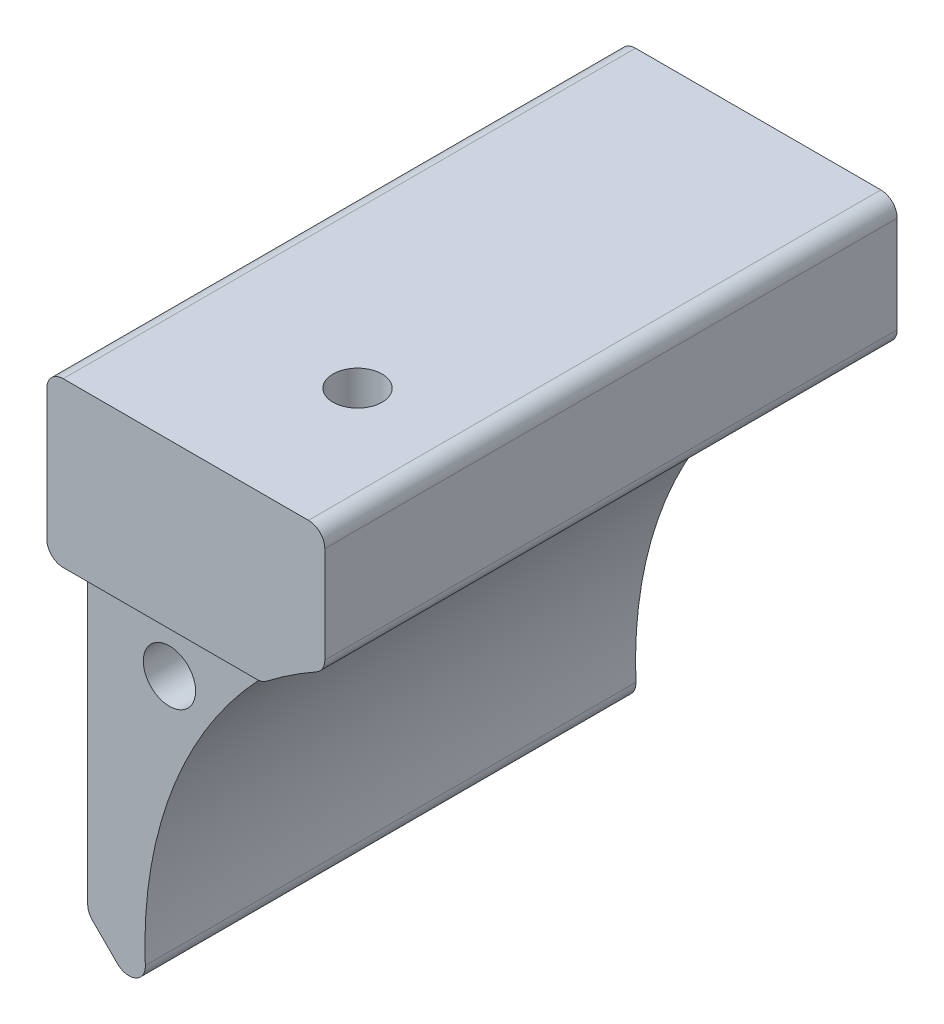
ISO-10303-21;
HEADER;
FILE_DESCRIPTION(('STEP AP214'),'2;1');
FILE_NAME('part.step','',(''),(''),'','','');
FILE_SCHEMA(('AUTOMOTIVE_DESIGN { 1 0 10303 214 1 1 1 1 }'));
ENDSEC;
DATA;
#1=APPLICATION_CONTEXT('core data for automotive mechanical design processes');
#2=APPLICATION_PROTOCOL_DEFINITION('international standard','automotive_design',2000,#1);
#3=PRODUCT_CONTEXT('',#1,'mechanical');
#4=PRODUCT('Part','Part','',(#3));
#5=PRODUCT_RELATED_PRODUCT_CATEGORY('part','',(#4));
#6=PRODUCT_DEFINITION_FORMATION('','',#4);
#7=PRODUCT_DEFINITION_CONTEXT('part definition',#1,'design');
#8=PRODUCT_DEFINITION('design','',#6,#7);
#9=PRODUCT_DEFINITION_SHAPE('','',#8);
#10=(LENGTH_UNIT() NAMED_UNIT(*) SI_UNIT(.MILLI.,.METRE.));
#11=(NAMED_UNIT(*) PLANE_ANGLE_UNIT() SI_UNIT($,.RADIAN.));
#12=(NAMED_UNIT(*) SI_UNIT($,.STERADIAN.) SOLID_ANGLE_UNIT());
#13=UNCERTAINTY_MEASURE_WITH_UNIT(LENGTH_MEASURE(1.E-05),#10,'distance_accuracy_value','');
#14=(GEOMETRIC_REPRESENTATION_CONTEXT(3) GLOBAL_UNCERTAINTY_ASSIGNED_CONTEXT((#13)) GLOBAL_UNIT_ASSIGNED_CONTEXT((#10,
#11,#12)) REPRESENTATION_CONTEXT('',''));
#15=CARTESIAN_POINT('',(0.,0.,0.));
#16=DIRECTION('',(0.,0.,1.));
#17=DIRECTION('',(1.,0.,0.));
#18=AXIS2_PLACEMENT_3D('',#15,#16,#17);
#19=CARTESIAN_POINT('',(36.83,25.4,19.05));
#20=DIRECTION('',(0.,0.,-1.));
#21=DIRECTION('',(-1.,0.,0.));
#22=AXIS2_PLACEMENT_3D('',#19,#20,#21);
#23=CYLINDRICAL_SURFACE('',#22,32.385);
#24=CARTESIAN_POINT('',(13.335,47.688409543976,13.335));
#25=CARTESIAN_POINT('',(13.1784766119884,47.5234064679626,13.3350076883867));
#26=CARTESIAN_POINT('',(13.0234629379012,47.3564801479212,13.3157882640373));
#27=CARTESIAN_POINT('',(12.796815553215,47.1073049650813,13.2590610502784));
#28=CARTESIAN_POINT('',(12.7221324315789,47.0243193556967,13.2354430569835));
#29=CARTESIAN_POINT('',(12.5752408176107,46.8594273918699,13.1787088544088));
#30=CARTESIAN_POINT('',(12.5030311164311,46.7775205226141,13.1455973612799));
#31=CARTESIAN_POINT('',(12.3334229947698,46.5832136683309,13.0543508972633));
#32=CARTESIAN_POINT('',(12.2374866292967,46.4717043220683,12.9915036611409));
#33=CARTESIAN_POINT('',(12.0541142977342,46.2557815744995,12.8449569731667));
#34=CARTESIAN_POINT('',(11.9666572433177,46.1513507741822,12.7613111986368));
#35=CARTESIAN_POINT('',(11.8315395771107,45.9881614423079,12.6028165787355));
#36=CARTESIAN_POINT('',(11.7804187615662,45.9258956960554,12.534549287547));
#37=CARTESIAN_POINT('',(11.6854333639466,45.8094242521853,12.386891093031));
#38=CARTESIAN_POINT('',(11.6415587354645,45.7552074059803,12.3075158772811));
#39=CARTESIAN_POINT('',(11.5732089867869,45.6702975411297,12.1580960504136));
#40=CARTESIAN_POINT('',(11.5466104838771,45.6370896019372,12.0904702906888));
#41=CARTESIAN_POINT('',(11.5006232448518,45.5795009319154,11.9492180449502));
#42=CARTESIAN_POINT('',(11.4812283301229,45.5551126368353,11.8755967677719));
#43=CARTESIAN_POINT('',(11.4510477848778,45.5170977553062,11.7229968413844));
#44=CARTESIAN_POINT('',(11.4403532169504,45.5035850136167,11.6439706814186));
#45=CARTESIAN_POINT('',(11.4290875422931,45.4893495891948,11.48407687588));
#46=CARTESIAN_POINT('',(11.4285067822604,45.4886147104063,11.4032110600435));
#47=CARTESIAN_POINT('',(11.436806299516,45.4991034208255,11.2552933354621));
#48=CARTESIAN_POINT('',(11.4442546928455,45.5085171706012,11.1880184655045));
#49=CARTESIAN_POINT('',(11.4658195935947,45.5357114848126,11.0563041571546));
#50=CARTESIAN_POINT('',(11.4799393848802,45.5534961696614,10.9918661322387));
#51=CARTESIAN_POINT('',(11.5192548314741,45.6028629702805,10.847499821178));
#52=CARTESIAN_POINT('',(11.5465330308157,45.637020262551,10.7690260549805));
#53=CARTESIAN_POINT('',(11.6088142097584,45.7145882097106,10.6201523733937));
#54=CARTESIAN_POINT('',(11.6438323637398,45.7580170358955,10.5497687367494));
#55=CARTESIAN_POINT('',(11.7374131030694,45.8733494371386,10.3863124041951));
#56=CARTESIAN_POINT('',(11.7993505160223,45.9491013487308,10.2979152597211));
#57=CARTESIAN_POINT('',(11.9319119802338,46.1095228593856,10.1372296934186));
#58=CARTESIAN_POINT('',(12.0025548052287,46.1942116728796,10.0649770659012));
#59=CARTESIAN_POINT('',(12.1314238082989,46.3469781000642,9.95155290873929));
#60=CARTESIAN_POINT('',(12.1882815550314,46.4138509232193,9.90713989177675));
#61=CARTESIAN_POINT('',(12.304839619222,46.549769966759,9.82599289338699));
#62=CARTESIAN_POINT('',(12.3645412772173,46.6188172067981,9.7892625782295));
#63=CARTESIAN_POINT('',(12.5471727701733,46.8281750278204,9.69000319706788));
#64=CARTESIAN_POINT('',(12.6736293376177,46.9707019637243,9.63840551421837));
#65=CARTESIAN_POINT('',(12.936771405676,47.2618774659836,9.56189949267807));
#66=CARTESIAN_POINT('',(13.0736541453998,47.4105767889815,9.53788982776896));
#67=CARTESIAN_POINT('',(13.3511420678159,47.7063322111869,9.52000876276544));
#68=CARTESIAN_POINT('',(13.4917453162943,47.8533891098254,9.52612199711666));
#69=CARTESIAN_POINT('',(13.7555229377572,48.1241700579003,9.56782161020136));
#70=CARTESIAN_POINT('',(13.8786673515774,48.2485041080893,9.59960806192232));
#71=CARTESIAN_POINT('',(14.1218793169272,48.4902292432726,9.69027350284481));
#72=CARTESIAN_POINT('',(14.241950732527,48.6076293176428,9.74911650480501));
#73=CARTESIAN_POINT('',(14.4421877940122,48.8005958028193,9.87657345314288));
#74=CARTESIAN_POINT('',(14.5242864439906,48.8788222679808,9.93811408916236));
#75=CARTESIAN_POINT('',(14.6812930446369,49.0269883840897,10.0781319241031));
#76=CARTESIAN_POINT('',(14.7562107024831,49.0969392527513,10.1565857798434));
#77=CARTESIAN_POINT('',(14.8797684863723,49.2113641628716,10.3118337516578));
#78=CARTESIAN_POINT('',(14.930574639518,49.2580661645682,10.3852506413046));
#79=CARTESIAN_POINT('',(15.0229957974978,49.3425710160744,10.5423246520955));
#80=CARTESIAN_POINT('',(15.0646212342899,49.3803839696746,10.6259699809382));
#81=CARTESIAN_POINT('',(15.1305987106132,49.4400892021544,10.7886461855446));
#82=CARTESIAN_POINT('',(15.1566187436528,49.4635317719265,10.8664269890782));
#83=CARTESIAN_POINT('',(15.1986757375582,49.5013452646282,11.0267717903517));
#84=CARTESIAN_POINT('',(15.214717679628,49.5157207140428,11.1093333789177));
#85=CARTESIAN_POINT('',(15.2357605917544,49.5345656275648,11.2772913901259));
#86=CARTESIAN_POINT('',(15.2407217415004,49.5389993650228,11.3626969210315));
#87=CARTESIAN_POINT('',(15.2391081125055,49.5375560875781,11.533309796876));
#88=CARTESIAN_POINT('',(15.232533909212,49.5316795870073,11.6185171514888));
#89=CARTESIAN_POINT('',(15.2090768700584,49.5106642162333,11.7809978733717));
#90=CARTESIAN_POINT('',(15.1928332854846,49.4960996085375,11.858441133176));
#91=CARTESIAN_POINT('',(15.1515805145574,49.4589924603249,12.0089233627841));
#92=CARTESIAN_POINT('',(15.1265700134227,49.4364487231669,12.0819616700471));
#93=CARTESIAN_POINT('',(15.067027652593,49.382555578019,12.227310041733));
#94=CARTESIAN_POINT('',(15.0319478126445,49.3506964486838,12.2992038429575));
#95=CARTESIAN_POINT('',(14.9548636839167,49.2803134293719,12.4355925486005));
#96=CARTESIAN_POINT('',(14.9128555835544,49.2417858701778,12.5000833469474));
#97=CARTESIAN_POINT('',(14.8009590830295,49.1385313112804,12.6517975991957));
#98=CARTESIAN_POINT('',(14.7276612553344,49.0703615303977,12.7341801028094));
#99=CARTESIAN_POINT('',(14.573045690148,48.9250410008117,12.8818099544788));
#100=CARTESIAN_POINT('',(14.4917077508195,48.8478675368178,12.9470125492092));
#101=CARTESIAN_POINT('',(14.2939622754741,48.6581181370542,13.0818009042286));
#102=CARTESIAN_POINT('',(14.1754868780411,48.5428125522876,13.1444857669573));
#103=CARTESIAN_POINT('',(13.9350523546374,48.3049835270208,13.242686855933));
#104=CARTESIAN_POINT('',(13.8130944570975,48.1824626158702,13.2782125425495));
#105=CARTESIAN_POINT('',(13.6315969027971,47.9971147091696,13.3127414709949));
#106=CARTESIAN_POINT('',(13.5720781261598,47.9358514873036,13.3211313778886));
#107=CARTESIAN_POINT('',(13.4533013423157,47.812619764453,13.3322583245684));
#108=CARTESIAN_POINT('',(13.3940432606298,47.7506514858707,13.3349970998109));
#109=CARTESIAN_POINT('',(13.335,47.688409543976,13.335));
#110=B_SPLINE_CURVE_WITH_KNOTS('',3,(#24,#25,#26,#27,#28,#29,#30,#31,#32,#33,#34,#35,#36,#37,
#38,#39,#40,#41,#42,#43,#44,#45,#46,#47,#48,#49,#50,#51,#52,#53,#54,#55,#56,#57,#58,#59,#60,#61,
#62,#63,#64,#65,#66,#67,#68,#69,#70,#71,#72,#73,#74,#75,#76,#77,#78,#79,#80,#81,#82,#83,#84,#85,
#86,#87,#88,#89,#90,#91,#92,#93,#94,#95,#96,#97,#98,#99,#100,#101,#102,#103,#104,#105,#106,#107,
#108,#109),.UNSPECIFIED.,.T.,.F.,(4,2,2,2,2,2,2,2,2,2,2,2,2,2,2,2,2,2,2,2,2,2,2,2,2,2,2,2,2,2,2,
2,2,2,2,2,2,2,2,2,2,2,4),(0.,0.681914945815989,1.02395035740759,1.36581614725854,
1.84426007558729,2.32148181372793,2.6374137151777,2.95290385040537,3.19173893203823,
3.43036868597695,3.67146504979722,3.91233128230528,4.11639842274227,4.32056611606572,
4.58855639743633,4.85707681602845,5.25050481256712,5.64479661644895,5.93953460419483,
6.23441292485613,6.82416844538339,7.43263440321242,8.04079001745469,8.5725286988837,
9.10356216476116,9.48936597518929,9.87464067990913,10.1758000146303,10.4766153614651,
10.7314342149974,10.9861257570426,11.2417311045603,11.4973237014264,11.737648322782,
11.978009001237,12.2353565515164,12.4928461567557,12.8796004722839,13.2673525314228,
13.7949554403331,14.3223744852162,14.5796833295377,14.8369131428241),.UNSPECIFIED.);
#111=CARTESIAN_POINT('',(13.335,47.688409543976,13.335));
#112=VERTEX_POINT('',#111);
#113=EDGE_CURVE('E202',#112,#112,#110,.T.);
#114=ORIENTED_EDGE('',*,*,#113,.F.);
#115=EDGE_LOOP('',(#114));
#116=FACE_BOUND('',#115,.T.);
#117=CARTESIAN_POINT('',(36.83,25.4,-19.05));
#118=DIRECTION('',(0.,0.,1.));
#119=DIRECTION('',(1.,0.,0.));
#120=AXIS2_PLACEMENT_3D('',#117,#118,#119);
#121=CIRCLE('',#120,32.385);
#122=CARTESIAN_POINT('',(17.0773132260454,51.0635849056604,-19.05));
#123=VERTEX_POINT('',#122);
#124=CARTESIAN_POINT('',(4.47337115952391,24.0447158675499,-19.05));
#125=VERTEX_POINT('',#124);
#126=EDGE_CURVE('E351',#123,#125,#121,.T.);
#127=ORIENTED_EDGE('',*,*,#126,.F.);
#128=DIRECTION('',(0.,0.,-1.));
#129=VECTOR('',#128,1.);
#130=CARTESIAN_POINT('',(17.0773132260454,51.0635849056604,19.05));
#131=LINE('',#130,#129);
#132=CARTESIAN_POINT('',(17.0773132260454,51.0635849056604,-22.225));
#133=VERTEX_POINT('',#132);
#134=EDGE_CURVE('E227',#123,#133,#131,.T.);
#135=ORIENTED_EDGE('',*,*,#134,.T.);
#136=CARTESIAN_POINT('',(36.83,25.4,-22.225));
#137=DIRECTION('',(0.,0.,-1.));
#138=DIRECTION('',(-1.,0.,0.));
#139=AXIS2_PLACEMENT_3D('',#136,#137,#138);
#140=CIRCLE('',#139,32.385);
#141=CARTESIAN_POINT('',(20.9430188679245,53.6204191235544,-22.225));
#142=VERTEX_POINT('',#141);
#143=EDGE_CURVE('E365',#133,#142,#140,.T.);
#144=ORIENTED_EDGE('',*,*,#143,.T.);
#145=DIRECTION('',(0.,0.,-1.));
#146=VECTOR('',#145,1.);
#147=CARTESIAN_POINT('',(20.9430188679245,53.6204191235544,19.05));
#148=LINE('',#147,#146);
#149=CARTESIAN_POINT('',(20.9430188679245,53.6204191235544,22.225));
#150=VERTEX_POINT('',#149);
#151=EDGE_CURVE('E224',#142,#150,#148,.F.);
#152=ORIENTED_EDGE('',*,*,#151,.T.);
#153=CARTESIAN_POINT('',(36.83,25.4,22.225));
#154=DIRECTION('',(0.,0.,-1.));
#155=DIRECTION('',(-1.,0.,0.));
#156=AXIS2_PLACEMENT_3D('',#153,#154,#155);
#157=CIRCLE('',#156,32.385);
#158=CARTESIAN_POINT('',(17.0773132260454,51.0635849056604,22.225));
#159=VERTEX_POINT('',#158);
#160=EDGE_CURVE('E325',#159,#150,#157,.T.);
#161=ORIENTED_EDGE('',*,*,#160,.F.);
#162=DIRECTION('',(0.,0.,-1.));
#163=VECTOR('',#162,1.);
#164=CARTESIAN_POINT('',(17.0773132260454,51.0635849056604,19.05));
#165=LINE('',#164,#163);
#166=CARTESIAN_POINT('',(17.0773132260454,51.0635849056604,19.05));
#167=VERTEX_POINT('',#166);
#168=EDGE_CURVE('E220',#159,#167,#165,.T.);
#169=ORIENTED_EDGE('',*,*,#168,.T.);
#170=CARTESIAN_POINT('',(36.83,25.4,19.05));
#171=DIRECTION('',(0.,0.,1.));
#172=DIRECTION('',(1.,0.,0.));
#173=AXIS2_PLACEMENT_3D('',#170,#171,#172);
#174=CIRCLE('',#173,32.385);
#175=CARTESIAN_POINT('',(4.47337115952391,24.0447158675499,19.05));
#176=VERTEX_POINT('',#175);
#177=EDGE_CURVE('E305',#167,#176,#174,.T.);
#178=ORIENTED_EDGE('',*,*,#177,.T.);
#179=DIRECTION('',(0.,0.,-1.));
#180=VECTOR('',#179,1.);
#181=CARTESIAN_POINT('',(4.47337115952391,24.0447158675499,19.05));
#182=LINE('',#181,#180);
#183=EDGE_CURVE('E210',#176,#125,#182,.T.);
#184=ORIENTED_EDGE('',*,*,#183,.T.);
#185=EDGE_LOOP('',(#127,#135,#144,#152,#161,#169,#178,#184));
#186=FACE_BOUND('',#185,.T.);
#187=ADVANCED_FACE('F41',(#116,#186),#23,.F.);
#188=CARTESIAN_POINT('',(21.59,0.,19.05));
#189=DIRECTION('',(-1.,0.,0.));
#190=DIRECTION('',(0.,-1.,0.));
#191=AXIS2_PLACEMENT_3D('',#188,#189,#190);
#192=PLANE('',#191);
#193=DIRECTION('',(0.,1.,0.));
#194=VECTOR('',#193,1.);
#195=CARTESIAN_POINT('',(21.59,63.5,-22.225));
#196=LINE('',#195,#194);
#197=CARTESIAN_POINT('',(21.59,54.7271022264389,-22.225));
#198=VERTEX_POINT('',#197);
#199=CARTESIAN_POINT('',(21.59,62.23,-22.225));
#200=VERTEX_POINT('',#199);
#201=EDGE_CURVE('E370',#198,#200,#196,.T.);
#202=ORIENTED_EDGE('',*,*,#201,.T.);
#203=DIRECTION('',(0.,0.,-1.));
#204=VECTOR('',#203,1.);
#205=CARTESIAN_POINT('',(21.59,62.23,22.225));
#206=LINE('',#205,#204);
#207=CARTESIAN_POINT('',(21.59,62.23,22.225));
#208=VERTEX_POINT('',#207);
#209=EDGE_CURVE('E251',#200,#208,#206,.F.);
#210=ORIENTED_EDGE('',*,*,#209,.T.);
#211=DIRECTION('',(0.,1.,0.));
#212=VECTOR('',#211,1.);
#213=CARTESIAN_POINT('',(21.59,63.5,22.225));
#214=LINE('',#213,#212);
#215=CARTESIAN_POINT('',(21.59,54.7271022264389,22.225));
#216=VERTEX_POINT('',#215);
#217=EDGE_CURVE('E332',#216,#208,#214,.T.);
#218=ORIENTED_EDGE('',*,*,#217,.F.);
#219=DIRECTION('',(0.,0.,1.));
#220=VECTOR('',#219,1.);
#221=CARTESIAN_POINT('',(21.59,54.7271022264389,-22.225));
#222=LINE('',#221,#220);
#223=EDGE_CURVE('E247',#216,#198,#222,.F.);
#224=ORIENTED_EDGE('',*,*,#223,.T.);
#225=EDGE_LOOP('',(#202,#210,#218,#224));
#226=FACE_BOUND('',#225,.T.);
#227=ADVANCED_FACE('F433',(#226),#192,.F.);
#228=CARTESIAN_POINT('',(0.,63.5,19.05));
#229=DIRECTION('',(0.,1.,0.));
#230=DIRECTION('',(0.,0.,1.));
#231=AXIS2_PLACEMENT_3D('',#228,#229,#230);
#232=PLANE('',#231);
#233=CARTESIAN_POINT('',(13.335,63.5,11.43));
#234=DIRECTION('',(0.,1.,0.));
#235=DIRECTION('',(0.,0.,1.));
#236=AXIS2_PLACEMENT_3D('',#233,#234,#235);
#237=CIRCLE('',#236,1.905);
#238=CARTESIAN_POINT('',(13.335,63.5,13.335));
#239=VERTEX_POINT('',#238);
#240=EDGE_CURVE('E404',#239,#239,#237,.T.);
#241=ORIENTED_EDGE('',*,*,#240,.F.);
#242=EDGE_LOOP('',(#241));
#243=FACE_BOUND('',#242,.T.);
#244=DIRECTION('',(-1.,0.,0.));
#245=VECTOR('',#244,1.);
#246=CARTESIAN_POINT('',(0.,63.5,22.225));
#247=LINE('',#246,#245);
#248=CARTESIAN_POINT('',(20.32,63.5,22.225));
#249=VERTEX_POINT('',#248);
#250=CARTESIAN_POINT('',(1.27,63.5,22.225));
#251=VERTEX_POINT('',#250);
#252=EDGE_CURVE('E335',#249,#251,#247,.T.);
#253=ORIENTED_EDGE('',*,*,#252,.F.);
#254=DIRECTION('',(0.,0.,-1.));
#255=VECTOR('',#254,1.);
#256=CARTESIAN_POINT('',(20.32,63.5,-22.225));
#257=LINE('',#256,#255);
#258=CARTESIAN_POINT('',(20.32,63.5,-22.225));
#259=VERTEX_POINT('',#258);
#260=EDGE_CURVE('E244',#249,#259,#257,.T.);
#261=ORIENTED_EDGE('',*,*,#260,.T.);
#262=DIRECTION('',(-1.,0.,0.));
#263=VECTOR('',#262,1.);
#264=CARTESIAN_POINT('',(0.,63.5,-22.225));
#265=LINE('',#264,#263);
#266=CARTESIAN_POINT('',(1.27,63.5,-22.225));
#267=VERTEX_POINT('',#266);
#268=EDGE_CURVE('E376',#259,#267,#265,.T.);
#269=ORIENTED_EDGE('',*,*,#268,.T.);
#270=DIRECTION('',(0.,0.,-1.));
#271=VECTOR('',#270,1.);
#272=CARTESIAN_POINT('',(1.27,63.5,19.05));
#273=LINE('',#272,#271);
#274=EDGE_CURVE('E241',#267,#251,#273,.F.);
#275=ORIENTED_EDGE('',*,*,#274,.T.);
#276=EDGE_LOOP('',(#253,#261,#269,#275));
#277=FACE_BOUND('',#276,.T.);
#278=ADVANCED_FACE('F431',(#243,#277),#232,.T.);
#279=CARTESIAN_POINT('',(0.,0.,19.05));
#280=DIRECTION('',(-1.,0.,0.));
#281=DIRECTION('',(0.,0.,1.));
#282=AXIS2_PLACEMENT_3D('',#279,#280,#281);
#283=PLANE('',#282);
#284=DIRECTION('',(0.,-1.,0.));
#285=VECTOR('',#284,1.);
#286=CARTESIAN_POINT('',(0.,63.5,-22.225));
#287=LINE('',#286,#285);
#288=CARTESIAN_POINT('',(0.,62.23,-22.225));
#289=VERTEX_POINT('',#288);
#290=CARTESIAN_POINT('',(0.,52.07,-22.225));
#291=VERTEX_POINT('',#290);
#292=EDGE_CURVE('E201',#289,#291,#287,.T.);
#293=ORIENTED_EDGE('',*,*,#292,.T.);
#294=DIRECTION('',(0.,0.,1.));
#295=VECTOR('',#294,1.);
#296=CARTESIAN_POINT('',(0.,52.07,19.05));
#297=LINE('',#296,#295);
#298=CARTESIAN_POINT('',(0.,52.07,-19.05));
#299=VERTEX_POINT('',#298);
#300=EDGE_CURVE('E280',#291,#299,#297,.T.);
#301=ORIENTED_EDGE('',*,*,#300,.T.);
#302=DIRECTION('',(0.,1.,0.));
#303=VECTOR('',#302,1.);
#304=CARTESIAN_POINT('',(0.,0.,-19.05));
#305=LINE('',#304,#303);
#306=CARTESIAN_POINT('',(0.,25.9260512242139,-19.05));
#307=VERTEX_POINT('',#306);
#308=EDGE_CURVE('E186',#307,#299,#305,.T.);
#309=ORIENTED_EDGE('',*,*,#308,.F.);
#310=DIRECTION('',(0.,0.,-1.));
#311=VECTOR('',#310,1.);
#312=CARTESIAN_POINT('',(0.,25.9260512242139,19.05));
#313=LINE('',#312,#311);
#314=CARTESIAN_POINT('',(0.,25.9260512242139,19.05));
#315=VERTEX_POINT('',#314);
#316=EDGE_CURVE('E272',#307,#315,#313,.F.);
#317=ORIENTED_EDGE('',*,*,#316,.T.);
#318=DIRECTION('',(0.,1.,0.));
#319=VECTOR('',#318,1.);
#320=CARTESIAN_POINT('',(0.,0.,19.05));
#321=LINE('',#320,#319);
#322=CARTESIAN_POINT('',(0.,52.07,19.05));
#323=VERTEX_POINT('',#322);
#324=EDGE_CURVE('E212',#315,#323,#321,.T.);
#325=ORIENTED_EDGE('',*,*,#324,.T.);
#326=DIRECTION('',(0.,0.,-1.));
#327=VECTOR('',#326,1.);
#328=CARTESIAN_POINT('',(0.,52.07,22.225));
#329=LINE('',#328,#327);
#330=CARTESIAN_POINT('',(0.,52.07,22.225));
#331=VERTEX_POINT('',#330);
#332=EDGE_CURVE('E278',#323,#331,#329,.F.);
#333=ORIENTED_EDGE('',*,*,#332,.T.);
#334=DIRECTION('',(0.,-1.,0.));
#335=VECTOR('',#334,1.);
#336=CARTESIAN_POINT('',(0.,63.5,22.225));
#337=LINE('',#336,#335);
#338=CARTESIAN_POINT('',(0.,62.23,22.225));
#339=VERTEX_POINT('',#338);
#340=EDGE_CURVE('E315',#339,#331,#337,.T.);
#341=ORIENTED_EDGE('',*,*,#340,.F.);
#342=DIRECTION('',(0.,0.,-1.));
#343=VECTOR('',#342,1.);
#344=CARTESIAN_POINT('',(0.,62.23,19.05));
#345=LINE('',#344,#343);
#346=EDGE_CURVE('E274',#339,#289,#345,.T.);
#347=ORIENTED_EDGE('',*,*,#346,.T.);
#348=EDGE_LOOP('',(#293,#301,#309,#317,#325,#333,#341,#347));
#349=FACE_BOUND('',#348,.T.);
#350=ADVANCED_FACE('F391',(#349),#283,.T.);
#351=CARTESIAN_POINT('',(6.35,44.45,19.05));
#352=DIRECTION('',(0.,0.,-1.));
#353=DIRECTION('',(-1.,0.,0.));
#354=AXIS2_PLACEMENT_3D('',#351,#352,#353);
#355=CYLINDRICAL_SURFACE('',#354,2.032);
#356=CARTESIAN_POINT('',(6.35,44.45,19.05));
#357=DIRECTION('',(0.,0.,1.));
#358=DIRECTION('',(1.,0.,0.));
#359=AXIS2_PLACEMENT_3D('',#356,#357,#358);
#360=CIRCLE('',#359,2.032);
#361=CARTESIAN_POINT('',(4.318,44.45,19.05));
#362=VERTEX_POINT('',#361);
#363=EDGE_CURVE('E344',#362,#362,#360,.T.);
#364=CARTESIAN_POINT('',(6.35,44.45,-19.05));
#365=DIRECTION('',(0.,0.,1.));
#366=DIRECTION('',(1.,0.,0.));
#367=AXIS2_PLACEMENT_3D('',#364,#365,#366);
#368=CIRCLE('',#367,2.032);
#369=CARTESIAN_POINT('',(4.318,44.45,-19.05));
#370=VERTEX_POINT('',#369);
#371=EDGE_CURVE('E342',#370,#370,#368,.T.);
#372=CARTESIAN_POINT('',(4.318,44.45,19.05));
#373=CARTESIAN_POINT('',(4.318,44.45,18.653125));
#374=CARTESIAN_POINT('',(4.318,44.45,18.25625));
#375=CARTESIAN_POINT('',(4.318,44.45,17.4625));
#376=CARTESIAN_POINT('',(4.318,44.45,17.065625));
#377=CARTESIAN_POINT('',(4.318,44.45,16.271875));
#378=CARTESIAN_POINT('',(4.318,44.45,15.875));
#379=CARTESIAN_POINT('',(4.318,44.45,15.08125));
#380=CARTESIAN_POINT('',(4.318,44.45,14.684375));
#381=CARTESIAN_POINT('',(4.318,44.45,13.890625));
#382=CARTESIAN_POINT('',(4.318,44.45,13.49375));
#383=CARTESIAN_POINT('',(4.318,44.45,12.7));
#384=CARTESIAN_POINT('',(4.318,44.45,12.303125));
#385=CARTESIAN_POINT('',(4.318,44.45,11.509375));
#386=CARTESIAN_POINT('',(4.318,44.45,11.1125));
#387=CARTESIAN_POINT('',(4.318,44.45,10.31875));
#388=CARTESIAN_POINT('',(4.318,44.45,9.921875));
#389=CARTESIAN_POINT('',(4.318,44.45,9.128125));
#390=CARTESIAN_POINT('',(4.318,44.45,8.73125));
#391=CARTESIAN_POINT('',(4.318,44.45,7.9375));
#392=CARTESIAN_POINT('',(4.318,44.45,7.540625));
#393=CARTESIAN_POINT('',(4.318,44.45,6.746875));
#394=CARTESIAN_POINT('',(4.318,44.45,6.35));
#395=CARTESIAN_POINT('',(4.318,44.45,5.55625));
#396=CARTESIAN_POINT('',(4.318,44.45,5.159375));
#397=CARTESIAN_POINT('',(4.318,44.45,4.365625));
#398=CARTESIAN_POINT('',(4.318,44.45,3.96875));
#399=CARTESIAN_POINT('',(4.318,44.45,3.175));
#400=CARTESIAN_POINT('',(4.318,44.45,2.778125));
#401=CARTESIAN_POINT('',(4.318,44.45,1.984375));
#402=CARTESIAN_POINT('',(4.318,44.45,1.5875));
#403=CARTESIAN_POINT('',(4.318,44.45,0.79375));
#404=CARTESIAN_POINT('',(4.318,44.45,0.396875));
#405=CARTESIAN_POINT('',(4.318,44.45,-0.396875));
#406=CARTESIAN_POINT('',(4.318,44.45,-0.79375));
#407=CARTESIAN_POINT('',(4.318,44.45,-1.5875));
#408=CARTESIAN_POINT('',(4.318,44.45,-1.984375));
#409=CARTESIAN_POINT('',(4.318,44.45,-2.778125));
#410=CARTESIAN_POINT('',(4.318,44.45,-3.175));
#411=CARTESIAN_POINT('',(4.318,44.45,-3.96875));
#412=CARTESIAN_POINT('',(4.318,44.45,-4.365625));
#413=CARTESIAN_POINT('',(4.318,44.45,-5.159375));
#414=CARTESIAN_POINT('',(4.318,44.45,-5.55625));
#415=CARTESIAN_POINT('',(4.318,44.45,-6.35));
#416=CARTESIAN_POINT('',(4.318,44.45,-6.746875));
#417=CARTESIAN_POINT('',(4.318,44.45,-7.540625));
#418=CARTESIAN_POINT('',(4.318,44.45,-7.9375));
#419=CARTESIAN_POINT('',(4.318,44.45,-8.73125));
#420=CARTESIAN_POINT('',(4.318,44.45,-9.128125));
#421=CARTESIAN_POINT('',(4.318,44.45,-9.921875));
#422=CARTESIAN_POINT('',(4.318,44.45,-10.31875));
#423=CARTESIAN_POINT('',(4.318,44.45,-11.1125));
#424=CARTESIAN_POINT('',(4.318,44.45,-11.509375));
#425=CARTESIAN_POINT('',(4.318,44.45,-12.303125));
#426=CARTESIAN_POINT('',(4.318,44.45,-12.7));
#427=CARTESIAN_POINT('',(4.318,44.45,-13.49375));
#428=CARTESIAN_POINT('',(4.318,44.45,-13.890625));
#429=CARTESIAN_POINT('',(4.318,44.45,-14.684375));
#430=CARTESIAN_POINT('',(4.318,44.45,-15.08125));
#431=CARTESIAN_POINT('',(4.318,44.45,-15.875));
#432=CARTESIAN_POINT('',(4.318,44.45,-16.271875));
#433=CARTESIAN_POINT('',(4.318,44.45,-17.065625));
#434=CARTESIAN_POINT('',(4.318,44.45,-17.4625));
#435=CARTESIAN_POINT('',(4.318,44.45,-18.25625));
#436=CARTESIAN_POINT('',(4.318,44.45,-18.653125));
#437=CARTESIAN_POINT('',(4.318,44.45,-19.05));
#438=B_SPLINE_CURVE_WITH_KNOTS('',3,(#372,#373,#374,#375,#376,#377,#378,#379,#380,#381,#382,
#383,#384,#385,#386,#387,#388,#389,#390,#391,#392,#393,#394,#395,#396,#397,#398,#399,#400,#401,
#402,#403,#404,#405,#406,#407,#408,#409,#410,#411,#412,#413,#414,#415,#416,#417,#418,#419,#420,
#421,#422,#423,#424,#425,#426,#427,#428,#429,#430,#431,#432,#433,#434,#435,#436,#437),
.UNSPECIFIED.,.F.,.F.,(4,2,2,2,2,2,2,2,2,2,2,2,2,2,2,2,2,2,2,2,2,2,2,2,2,2,2,2,2,2,2,2,4),(0.,
1.190625,2.38125,3.571875,4.7625,5.953125,7.14375,8.334375,9.525,10.715625,11.90625,13.096875,
14.2875,15.478125,16.66875,17.859375,19.05,20.240625,21.43125,22.621875,23.8125,25.003125,
26.19375,27.384375,28.575,29.765625,30.95625,32.146875,33.3375,34.528125,35.71875,36.909375,
38.1),.UNSPECIFIED.);
#439=EDGE_CURVE('BSEAM428',#362,#370,#438,.T.);
#440=ORIENTED_EDGE('',*,*,#363,.T.);
#441=ORIENTED_EDGE('',*,*,#371,.F.);
#442=ORIENTED_EDGE('',*,*,#439,.T.);
#443=ORIENTED_EDGE('',*,*,#439,.F.);
#444=EDGE_LOOP('',(#440,#442,#441,#443));
#445=FACE_BOUND('',#444,.T.);
#446=ADVANCED_FACE('F428',(#445),#355,.F.);
#447=CARTESIAN_POINT('',(12.7,12.7000000000001,19.05));
#448=DIRECTION('',(0.707106781186547,0.707106781186548,0.));
#449=DIRECTION('',(-0.707106781186548,0.707106781186547,0.));
#450=AXIS2_PLACEMENT_3D('',#447,#448,#449);
#451=PLANE('',#450);
#452=DIRECTION('',(0.707106781186548,-0.707106781186547,0.));
#453=VECTOR('',#452,1.);
#454=CARTESIAN_POINT('',(12.7,12.7000000000001,-19.05));
#455=LINE('',#454,#453);
#456=CARTESIAN_POINT('',(0.371974387893088,25.028025612107,-19.05));
#457=VERTEX_POINT('',#456);
#458=CARTESIAN_POINT('',(2.30645814190813,23.093541858092,-19.05));
#459=VERTEX_POINT('',#458);
#460=EDGE_CURVE('E215',#457,#459,#455,.T.);
#461=ORIENTED_EDGE('',*,*,#460,.T.);
#462=DIRECTION('',(0.,0.,1.));
#463=VECTOR('',#462,1.);
#464=CARTESIAN_POINT('',(2.30645814190813,23.093541858092,19.05));
#465=LINE('',#464,#463);
#466=CARTESIAN_POINT('',(2.30645814190813,23.093541858092,19.05));
#467=VERTEX_POINT('',#466);
#468=EDGE_CURVE('E56',#459,#467,#465,.T.);
#469=ORIENTED_EDGE('',*,*,#468,.T.);
#470=DIRECTION('',(0.707106781186548,-0.707106781186547,0.));
#471=VECTOR('',#470,1.);
#472=CARTESIAN_POINT('',(12.7,12.7000000000001,19.05));
#473=LINE('',#472,#471);
#474=CARTESIAN_POINT('',(0.371974387893088,25.028025612107,19.05));
#475=VERTEX_POINT('',#474);
#476=EDGE_CURVE('E207',#475,#467,#473,.T.);
#477=ORIENTED_EDGE('',*,*,#476,.F.);
#478=DIRECTION('',(0.,0.,-1.));
#479=VECTOR('',#478,1.);
#480=CARTESIAN_POINT('',(0.371974387893086,25.028025612107,-19.05));
#481=LINE('',#480,#479);
#482=EDGE_CURVE('E286',#475,#457,#481,.T.);
#483=ORIENTED_EDGE('',*,*,#482,.T.);
#484=EDGE_LOOP('',(#461,#469,#477,#483));
#485=FACE_BOUND('',#484,.T.);
#486=ADVANCED_FACE('F354',(#485),#451,.F.);
#487=CARTESIAN_POINT('',(0.,0.,19.05));
#488=DIRECTION('',(0.,0.,1.));
#489=DIRECTION('',(1.,0.,0.));
#490=AXIS2_PLACEMENT_3D('',#487,#488,#489);
#491=PLANE('',#490);
#492=ORIENTED_EDGE('',*,*,#476,.T.);
#493=CARTESIAN_POINT('',(3.20448375401505,23.9915674701989,19.05));
#494=DIRECTION('',(0.,0.,1.));
#495=DIRECTION('',(1.,0.,0.));
#496=AXIS2_PLACEMENT_3D('',#493,#494,#495);
#497=CIRCLE('',#496,1.27);
#498=EDGE_CURVE('E291',#467,#176,#497,.T.);
#499=ORIENTED_EDGE('',*,*,#498,.T.);
#500=ORIENTED_EDGE('',*,*,#177,.F.);
#501=CARTESIAN_POINT('',(16.3026980584393,52.07,19.05));
#502=DIRECTION('',(0.,0.,1.));
#503=DIRECTION('',(1.,0.,0.));
#504=AXIS2_PLACEMENT_3D('',#501,#502,#503);
#505=CIRCLE('',#504,1.27);
#506=CARTESIAN_POINT('',(16.3026980584393,50.8,19.05));
#507=VERTEX_POINT('',#506);
#508=EDGE_CURVE('E191',#167,#507,#505,.F.);
#509=ORIENTED_EDGE('',*,*,#508,.T.);
#510=DIRECTION('',(1.,0.,0.));
#511=VECTOR('',#510,1.);
#512=CARTESIAN_POINT('',(0.,50.8,19.05));
#513=LINE('',#512,#511);
#514=CARTESIAN_POINT('',(1.27,50.8,19.05));
#515=VERTEX_POINT('',#514);
#516=EDGE_CURVE('E303',#515,#507,#513,.T.);
#517=ORIENTED_EDGE('',*,*,#516,.F.);
#518=CARTESIAN_POINT('',(1.27,52.07,19.05));
#519=DIRECTION('',(0.,0.,1.));
#520=DIRECTION('',(1.,0.,0.));
#521=AXIS2_PLACEMENT_3D('',#518,#519,#520);
#522=CIRCLE('',#521,1.27);
#523=EDGE_CURVE('E11',#515,#323,#522,.F.);
#524=ORIENTED_EDGE('',*,*,#523,.T.);
#525=ORIENTED_EDGE('',*,*,#324,.F.);
#526=CARTESIAN_POINT('',(1.27,25.9260512242139,19.05));
#527=DIRECTION('',(0.,0.,1.));
#528=DIRECTION('',(1.,0.,0.));
#529=AXIS2_PLACEMENT_3D('',#526,#527,#528);
#530=CIRCLE('',#529,1.27);
#531=EDGE_CURVE('E63',#315,#475,#530,.T.);
#532=ORIENTED_EDGE('',*,*,#531,.T.);
#533=EDGE_LOOP('',(#492,#499,#500,#509,#517,#524,#525,#532));
#534=FACE_BOUND('',#533,.T.);
#535=ORIENTED_EDGE('',*,*,#363,.F.);
#536=EDGE_LOOP('',(#535));
#537=FACE_BOUND('',#536,.T.);
#538=ADVANCED_FACE('F301',(#534,#537),#491,.T.);
#539=CARTESIAN_POINT('',(0.,0.,-19.05));
#540=DIRECTION('',(0.,0.,1.));
#541=DIRECTION('',(1.,0.,0.));
#542=AXIS2_PLACEMENT_3D('',#539,#540,#541);
#543=PLANE('',#542);
#544=ORIENTED_EDGE('',*,*,#371,.T.);
#545=EDGE_LOOP('',(#544));
#546=FACE_BOUND('',#545,.T.);
#547=ORIENTED_EDGE('',*,*,#126,.T.);
#548=CARTESIAN_POINT('',(3.20448375401505,23.9915674701989,-19.05));
#549=DIRECTION('',(0.,0.,1.));
#550=DIRECTION('',(1.,0.,0.));
#551=AXIS2_PLACEMENT_3D('',#548,#549,#550);
#552=CIRCLE('',#551,1.27);
#553=EDGE_CURVE('E284',#125,#459,#552,.F.);
#554=ORIENTED_EDGE('',*,*,#553,.T.);
#555=ORIENTED_EDGE('',*,*,#460,.F.);
#556=CARTESIAN_POINT('',(1.27,25.9260512242139,-19.05));
#557=DIRECTION('',(0.,0.,1.));
#558=DIRECTION('',(1.,0.,0.));
#559=AXIS2_PLACEMENT_3D('',#556,#557,#558);
#560=CIRCLE('',#559,1.27);
#561=EDGE_CURVE('E282',#457,#307,#560,.F.);
#562=ORIENTED_EDGE('',*,*,#561,.T.);
#563=ORIENTED_EDGE('',*,*,#308,.T.);
#564=CARTESIAN_POINT('',(1.27,52.07,-19.05));
#565=DIRECTION('',(0.,0.,1.));
#566=DIRECTION('',(1.,0.,0.));
#567=AXIS2_PLACEMENT_3D('',#564,#565,#566);
#568=CIRCLE('',#567,1.27);
#569=CARTESIAN_POINT('',(1.27,50.8,-19.05));
#570=VERTEX_POINT('',#569);
#571=EDGE_CURVE('E49',#299,#570,#568,.T.);
#572=ORIENTED_EDGE('',*,*,#571,.T.);
#573=DIRECTION('',(1.,0.,0.));
#574=VECTOR('',#573,1.);
#575=CARTESIAN_POINT('',(0.,50.8,-19.05));
#576=LINE('',#575,#574);
#577=CARTESIAN_POINT('',(16.3026980584393,50.8,-19.05));
#578=VERTEX_POINT('',#577);
#579=EDGE_CURVE('E184',#570,#578,#576,.T.);
#580=ORIENTED_EDGE('',*,*,#579,.T.);
#581=CARTESIAN_POINT('',(16.3026980584393,52.07,-19.05));
#582=DIRECTION('',(0.,0.,1.));
#583=DIRECTION('',(1.,0.,0.));
#584=AXIS2_PLACEMENT_3D('',#581,#582,#583);
#585=CIRCLE('',#584,1.27);
#586=EDGE_CURVE('E293',#578,#123,#585,.T.);
#587=ORIENTED_EDGE('',*,*,#586,.T.);
#588=EDGE_LOOP('',(#547,#554,#555,#562,#563,#572,#580,#587));
#589=FACE_BOUND('',#588,.T.);
#590=ADVANCED_FACE('F182',(#546,#589),#543,.F.);
#591=CARTESIAN_POINT('',(0.,50.8,22.225));
#592=DIRECTION('',(0.,1.,0.));
#593=DIRECTION('',(0.,0.,1.));
#594=AXIS2_PLACEMENT_3D('',#591,#592,#593);
#595=PLANE('',#594);
#596=ORIENTED_EDGE('',*,*,#516,.T.);
#597=DIRECTION('',(0.,0.,1.));
#598=VECTOR('',#597,1.);
#599=CARTESIAN_POINT('',(16.3026980584393,50.8,22.225));
#600=LINE('',#599,#598);
#601=CARTESIAN_POINT('',(16.3026980584393,50.8,22.225));
#602=VERTEX_POINT('',#601);
#603=EDGE_CURVE('E269',#507,#602,#600,.T.);
#604=ORIENTED_EDGE('',*,*,#603,.T.);
#605=DIRECTION('',(1.,0.,0.));
#606=VECTOR('',#605,1.);
#607=CARTESIAN_POINT('',(0.,50.8,22.225));
#608=LINE('',#607,#606);
#609=CARTESIAN_POINT('',(1.27,50.8,22.225));
#610=VERTEX_POINT('',#609);
#611=EDGE_CURVE('E327',#610,#602,#608,.T.);
#612=ORIENTED_EDGE('',*,*,#611,.F.);
#613=DIRECTION('',(0.,0.,-1.));
#614=VECTOR('',#613,1.);
#615=CARTESIAN_POINT('',(1.27,50.8,19.05));
#616=LINE('',#615,#614);
#617=EDGE_CURVE('E266',#610,#515,#616,.T.);
#618=ORIENTED_EDGE('',*,*,#617,.T.);
#619=EDGE_LOOP('',(#596,#604,#612,#618));
#620=FACE_BOUND('',#619,.T.);
#621=ADVANCED_FACE('F310',(#620),#595,.F.);
#622=CARTESIAN_POINT('',(36.83,25.4,22.225));
#623=DIRECTION('',(0.,0.,-1.));
#624=DIRECTION('',(-1.,0.,0.));
#625=AXIS2_PLACEMENT_3D('',#622,#623,#624);
#626=PLANE('',#625);
#627=ORIENTED_EDGE('',*,*,#217,.T.);
#628=CARTESIAN_POINT('',(20.32,62.23,22.225));
#629=DIRECTION('',(0.,0.,-1.));
#630=DIRECTION('',(-1.,0.,0.));
#631=AXIS2_PLACEMENT_3D('',#628,#629,#630);
#632=CIRCLE('',#631,1.27);
#633=EDGE_CURVE('E264',#208,#249,#632,.F.);
#634=ORIENTED_EDGE('',*,*,#633,.T.);
#635=ORIENTED_EDGE('',*,*,#252,.T.);
#636=CARTESIAN_POINT('',(1.27,62.23,22.225));
#637=DIRECTION('',(0.,0.,-1.));
#638=DIRECTION('',(-1.,0.,0.));
#639=AXIS2_PLACEMENT_3D('',#636,#637,#638);
#640=CIRCLE('',#639,1.27);
#641=EDGE_CURVE('E254',#251,#339,#640,.F.);
#642=ORIENTED_EDGE('',*,*,#641,.T.);
#643=ORIENTED_EDGE('',*,*,#340,.T.);
#644=CARTESIAN_POINT('',(1.27,52.07,22.225));
#645=DIRECTION('',(0.,0.,-1.));
#646=DIRECTION('',(-1.,0.,0.));
#647=AXIS2_PLACEMENT_3D('',#644,#645,#646);
#648=CIRCLE('',#647,1.27);
#649=EDGE_CURVE('E256',#331,#610,#648,.F.);
#650=ORIENTED_EDGE('',*,*,#649,.T.);
#651=ORIENTED_EDGE('',*,*,#611,.T.);
#652=CARTESIAN_POINT('',(16.3026980584393,52.07,22.225));
#653=DIRECTION('',(0.,0.,-1.));
#654=DIRECTION('',(-1.,0.,0.));
#655=AXIS2_PLACEMENT_3D('',#652,#653,#654);
#656=CIRCLE('',#655,1.27);
#657=EDGE_CURVE('E258',#602,#159,#656,.F.);
#658=ORIENTED_EDGE('',*,*,#657,.T.);
#659=ORIENTED_EDGE('',*,*,#160,.T.);
#660=CARTESIAN_POINT('',(20.32,54.7271022264389,22.225));
#661=DIRECTION('',(0.,0.,-1.));
#662=DIRECTION('',(-1.,0.,0.));
#663=AXIS2_PLACEMENT_3D('',#660,#661,#662);
#664=CIRCLE('',#663,1.27);
#665=EDGE_CURVE('E261',#150,#216,#664,.F.);
#666=ORIENTED_EDGE('',*,*,#665,.T.);
#667=EDGE_LOOP('',(#627,#634,#635,#642,#643,#650,#651,#658,#659,#666));
#668=FACE_BOUND('',#667,.T.);
#669=ADVANCED_FACE('F324',(#668),#626,.F.);
#670=CARTESIAN_POINT('',(0.,50.8,-22.225));
#671=DIRECTION('',(0.,-1.,0.));
#672=DIRECTION('',(0.,0.,-1.));
#673=AXIS2_PLACEMENT_3D('',#670,#671,#672);
#674=PLANE('',#673);
#675=DIRECTION('',(1.,0.,0.));
#676=VECTOR('',#675,1.);
#677=CARTESIAN_POINT('',(0.,50.8,-22.225));
#678=LINE('',#677,#676);
#679=CARTESIAN_POINT('',(1.27,50.8,-22.225));
#680=VERTEX_POINT('',#679);
#681=CARTESIAN_POINT('',(16.3026980584393,50.8,-22.225));
#682=VERTEX_POINT('',#681);
#683=EDGE_CURVE('E316',#680,#682,#678,.T.);
#684=ORIENTED_EDGE('',*,*,#683,.T.);
#685=DIRECTION('',(0.,0.,-1.));
#686=VECTOR('',#685,1.);
#687=CARTESIAN_POINT('',(16.3026980584393,50.8,-22.225));
#688=LINE('',#687,#686);
#689=EDGE_CURVE('E199',#682,#578,#688,.F.);
#690=ORIENTED_EDGE('',*,*,#689,.T.);
#691=ORIENTED_EDGE('',*,*,#579,.F.);
#692=DIRECTION('',(0.,0.,1.));
#693=VECTOR('',#692,1.);
#694=CARTESIAN_POINT('',(1.27,50.8,-22.225));
#695=LINE('',#694,#693);
#696=EDGE_CURVE('E196',#570,#680,#695,.F.);
#697=ORIENTED_EDGE('',*,*,#696,.T.);
#698=EDGE_LOOP('',(#684,#690,#691,#697));
#699=FACE_BOUND('',#698,.T.);
#700=ADVANCED_FACE('F195',(#699),#674,.T.);
#701=CARTESIAN_POINT('',(36.83,25.4,-22.225));
#702=DIRECTION('',(0.,0.,1.));
#703=DIRECTION('',(-1.,0.,0.));
#704=AXIS2_PLACEMENT_3D('',#701,#702,#703);
#705=PLANE('',#704);
#706=ORIENTED_EDGE('',*,*,#143,.F.);
#707=CARTESIAN_POINT('',(16.3026980584393,52.07,-22.225));
#708=DIRECTION('',(0.,0.,1.));
#709=DIRECTION('',(1.,0.,0.));
#710=AXIS2_PLACEMENT_3D('',#707,#708,#709);
#711=CIRCLE('',#710,1.27);
#712=EDGE_CURVE('E238',#133,#682,#711,.F.);
#713=ORIENTED_EDGE('',*,*,#712,.T.);
#714=ORIENTED_EDGE('',*,*,#683,.F.);
#715=CARTESIAN_POINT('',(1.27,52.07,-22.225));
#716=DIRECTION('',(0.,0.,1.));
#717=DIRECTION('',(1.,0.,0.));
#718=AXIS2_PLACEMENT_3D('',#715,#716,#717);
#719=CIRCLE('',#718,1.27);
#720=EDGE_CURVE('E206',#680,#291,#719,.F.);
#721=ORIENTED_EDGE('',*,*,#720,.T.);
#722=ORIENTED_EDGE('',*,*,#292,.F.);
#723=CARTESIAN_POINT('',(1.27,62.23,-22.225));
#724=DIRECTION('',(0.,0.,1.));
#725=DIRECTION('',(1.,0.,0.));
#726=AXIS2_PLACEMENT_3D('',#723,#724,#725);
#727=CIRCLE('',#726,1.27);
#728=EDGE_CURVE('E230',#289,#267,#727,.F.);
#729=ORIENTED_EDGE('',*,*,#728,.T.);
#730=ORIENTED_EDGE('',*,*,#268,.F.);
#731=CARTESIAN_POINT('',(20.32,62.23,-22.225));
#732=DIRECTION('',(0.,0.,1.));
#733=DIRECTION('',(1.,0.,0.));
#734=AXIS2_PLACEMENT_3D('',#731,#732,#733);
#735=CIRCLE('',#734,1.27);
#736=EDGE_CURVE('E236',#259,#200,#735,.F.);
#737=ORIENTED_EDGE('',*,*,#736,.T.);
#738=ORIENTED_EDGE('',*,*,#201,.F.);
#739=CARTESIAN_POINT('',(20.32,54.7271022264389,-22.225));
#740=DIRECTION('',(0.,0.,1.));
#741=DIRECTION('',(1.,0.,0.));
#742=AXIS2_PLACEMENT_3D('',#739,#740,#741);
#743=CIRCLE('',#742,1.27);
#744=EDGE_CURVE('E233',#198,#142,#743,.F.);
#745=ORIENTED_EDGE('',*,*,#744,.T.);
#746=EDGE_LOOP('',(#706,#713,#714,#721,#722,#729,#730,#737,#738,#745));
#747=FACE_BOUND('',#746,.T.);
#748=ADVANCED_FACE('F367',(#747),#705,.F.);
#749=CARTESIAN_POINT('',(16.3026980584393,52.07,19.05));
#750=DIRECTION('',(0.,0.,-1.));
#751=DIRECTION('',(-1.,0.,0.));
#752=AXIS2_PLACEMENT_3D('',#749,#750,#751);
#753=CYLINDRICAL_SURFACE('',#752,1.27);
#754=ORIENTED_EDGE('',*,*,#712,.F.);
#755=ORIENTED_EDGE('',*,*,#134,.F.);
#756=ORIENTED_EDGE('',*,*,#586,.F.);
#757=ORIENTED_EDGE('',*,*,#689,.F.);
#758=EDGE_LOOP('',(#754,#755,#756,#757));
#759=FACE_BOUND('',#758,.T.);
#760=ADVANCED_FACE('F363',(#759),#753,.T.);
#761=CARTESIAN_POINT('',(20.32,62.23,19.05));
#762=DIRECTION('',(0.,0.,1.));
#763=DIRECTION('',(1.,0.,0.));
#764=AXIS2_PLACEMENT_3D('',#761,#762,#763);
#765=CYLINDRICAL_SURFACE('',#764,1.27);
#766=ORIENTED_EDGE('',*,*,#633,.F.);
#767=ORIENTED_EDGE('',*,*,#209,.F.);
#768=ORIENTED_EDGE('',*,*,#736,.F.);
#769=ORIENTED_EDGE('',*,*,#260,.F.);
#770=EDGE_LOOP('',(#766,#767,#768,#769));
#771=FACE_BOUND('',#770,.T.);
#772=ADVANCED_FACE('F446',(#771),#765,.T.);
#773=CARTESIAN_POINT('',(20.32,54.7271022264389,19.05));
#774=DIRECTION('',(0.,0.,-1.));
#775=DIRECTION('',(-1.,0.,0.));
#776=AXIS2_PLACEMENT_3D('',#773,#774,#775);
#777=CYLINDRICAL_SURFACE('',#776,1.27);
#778=ORIENTED_EDGE('',*,*,#665,.F.);
#779=ORIENTED_EDGE('',*,*,#151,.F.);
#780=ORIENTED_EDGE('',*,*,#744,.F.);
#781=ORIENTED_EDGE('',*,*,#223,.F.);
#782=EDGE_LOOP('',(#778,#779,#780,#781));
#783=FACE_BOUND('',#782,.T.);
#784=ADVANCED_FACE('F467',(#783),#777,.T.);
#785=CARTESIAN_POINT('',(16.3026980584393,52.07,19.05));
#786=DIRECTION('',(0.,0.,-1.));
#787=DIRECTION('',(-1.,0.,0.));
#788=AXIS2_PLACEMENT_3D('',#785,#786,#787);
#789=CYLINDRICAL_SURFACE('',#788,1.27);
#790=ORIENTED_EDGE('',*,*,#657,.F.);
#791=ORIENTED_EDGE('',*,*,#603,.F.);
#792=ORIENTED_EDGE('',*,*,#508,.F.);
#793=ORIENTED_EDGE('',*,*,#168,.F.);
#794=EDGE_LOOP('',(#790,#791,#792,#793));
#795=FACE_BOUND('',#794,.T.);
#796=ADVANCED_FACE('F319',(#795),#789,.T.);
#797=CARTESIAN_POINT('',(1.27,52.07,19.05));
#798=DIRECTION('',(0.,0.,1.));
#799=DIRECTION('',(1.,0.,0.));
#800=AXIS2_PLACEMENT_3D('',#797,#798,#799);
#801=CYLINDRICAL_SURFACE('',#800,1.27);
#802=ORIENTED_EDGE('',*,*,#720,.F.);
#803=ORIENTED_EDGE('',*,*,#696,.F.);
#804=ORIENTED_EDGE('',*,*,#571,.F.);
#805=ORIENTED_EDGE('',*,*,#300,.F.);
#806=EDGE_LOOP('',(#802,#803,#804,#805));
#807=FACE_BOUND('',#806,.T.);
#808=ADVANCED_FACE('F205',(#807),#801,.T.);
#809=CARTESIAN_POINT('',(1.27,52.07,22.225));
#810=DIRECTION('',(0.,0.,1.));
#811=DIRECTION('',(1.,0.,0.));
#812=AXIS2_PLACEMENT_3D('',#809,#810,#811);
#813=CYLINDRICAL_SURFACE('',#812,1.27);
#814=ORIENTED_EDGE('',*,*,#649,.F.);
#815=ORIENTED_EDGE('',*,*,#332,.F.);
#816=ORIENTED_EDGE('',*,*,#523,.F.);
#817=ORIENTED_EDGE('',*,*,#617,.F.);
#818=EDGE_LOOP('',(#814,#815,#816,#817));
#819=FACE_BOUND('',#818,.T.);
#820=ADVANCED_FACE('F387',(#819),#813,.T.);
#821=CARTESIAN_POINT('',(3.20448375401505,23.9915674701989,19.05));
#822=DIRECTION('',(0.,0.,-1.));
#823=DIRECTION('',(-1.,0.,0.));
#824=AXIS2_PLACEMENT_3D('',#821,#822,#823);
#825=CYLINDRICAL_SURFACE('',#824,1.27);
#826=ORIENTED_EDGE('',*,*,#498,.F.);
#827=ORIENTED_EDGE('',*,*,#468,.F.);
#828=ORIENTED_EDGE('',*,*,#553,.F.);
#829=ORIENTED_EDGE('',*,*,#183,.F.);
#830=EDGE_LOOP('',(#826,#827,#828,#829));
#831=FACE_BOUND('',#830,.T.);
#832=ADVANCED_FACE('F358',(#831),#825,.T.);
#833=CARTESIAN_POINT('',(1.27,62.23,19.05));
#834=DIRECTION('',(0.,0.,-1.));
#835=DIRECTION('',(-1.,0.,0.));
#836=AXIS2_PLACEMENT_3D('',#833,#834,#835);
#837=CYLINDRICAL_SURFACE('',#836,1.27);
#838=ORIENTED_EDGE('',*,*,#641,.F.);
#839=ORIENTED_EDGE('',*,*,#274,.F.);
#840=ORIENTED_EDGE('',*,*,#728,.F.);
#841=ORIENTED_EDGE('',*,*,#346,.F.);
#842=EDGE_LOOP('',(#838,#839,#840,#841));
#843=FACE_BOUND('',#842,.T.);
#844=ADVANCED_FACE('F453',(#843),#837,.T.);
#845=CARTESIAN_POINT('',(1.27,25.9260512242139,19.05));
#846=DIRECTION('',(0.,0.,1.));
#847=DIRECTION('',(1.,0.,0.));
#848=AXIS2_PLACEMENT_3D('',#845,#846,#847);
#849=CYLINDRICAL_SURFACE('',#848,1.27);
#850=ORIENTED_EDGE('',*,*,#531,.F.);
#851=ORIENTED_EDGE('',*,*,#316,.F.);
#852=ORIENTED_EDGE('',*,*,#561,.F.);
#853=ORIENTED_EDGE('',*,*,#482,.F.);
#854=EDGE_LOOP('',(#850,#851,#852,#853));
#855=FACE_BOUND('',#854,.T.);
#856=ADVANCED_FACE('F43',(#855),#849,.T.);
#857=CARTESIAN_POINT('',(13.335,22.7215674701989,11.43));
#858=DIRECTION('',(0.,1.,0.));
#859=DIRECTION('',(0.,0.,1.));
#860=AXIS2_PLACEMENT_3D('',#857,#858,#859);
#861=CYLINDRICAL_SURFACE('',#860,1.905);
#862=ORIENTED_EDGE('',*,*,#113,.T.);
#863=EDGE_LOOP('',(#862));
#864=FACE_BOUND('',#863,.T.);
#865=ORIENTED_EDGE('',*,*,#240,.T.);
#866=EDGE_LOOP('',(#865));
#867=FACE_BOUND('',#866,.T.);
#868=ADVANCED_FACE('F408',(#864,#867),#861,.F.);
#869=CLOSED_SHELL('',(#187,#227,#278,#350,#446,#486,#538,#590,#621,#669,#700,#748,#760,#772,
#784,#796,#808,#820,#832,#844,#856,#868));
#870=MANIFOLD_SOLID_BREP('B2',#869);
#871=ADVANCED_BREP_SHAPE_REPRESENTATION('',(#18,#870),#14);
#872=SHAPE_DEFINITION_REPRESENTATION(#9,#871);
ENDSEC;
END-ISO-10303-21;
